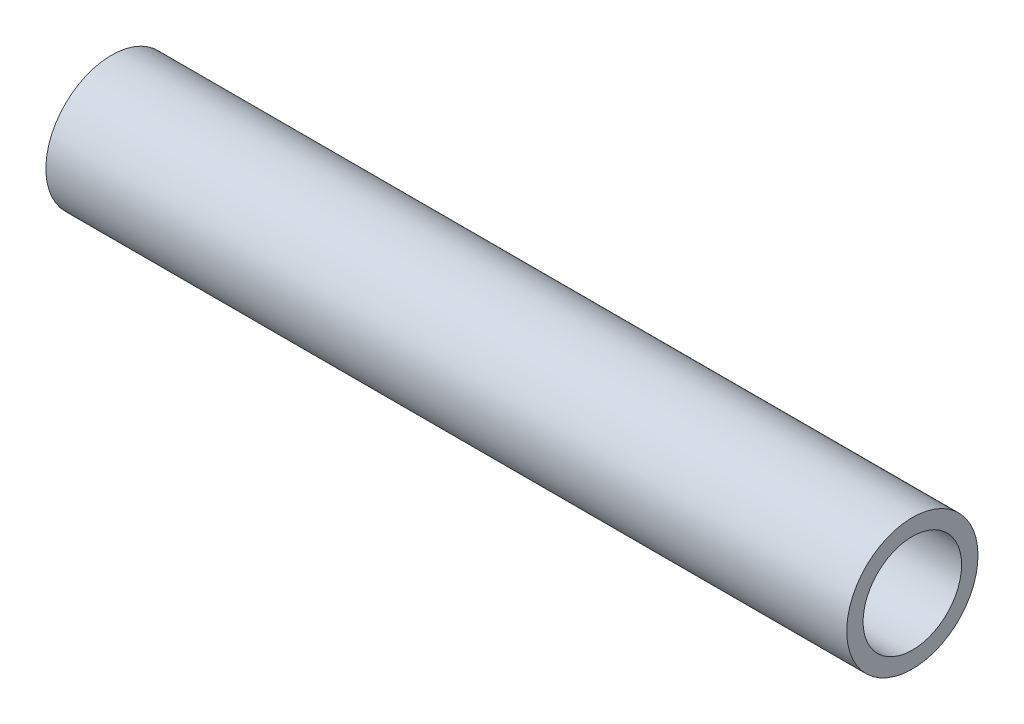
ISO-10303-21;
HEADER;
FILE_DESCRIPTION(('STEP AP214'),'2;1');
FILE_NAME('part.step','',(''),(''),'','','');
FILE_SCHEMA(('AUTOMOTIVE_DESIGN { 1 0 10303 214 1 1 1 1 }'));
ENDSEC;
DATA;
#1=APPLICATION_CONTEXT('core data for automotive mechanical design processes');
#2=APPLICATION_PROTOCOL_DEFINITION('international standard','automotive_design',2000,#1);
#3=PRODUCT_CONTEXT('',#1,'mechanical');
#4=PRODUCT('Part','Part','',(#3));
#5=PRODUCT_RELATED_PRODUCT_CATEGORY('part','',(#4));
#6=PRODUCT_DEFINITION_FORMATION('','',#4);
#7=PRODUCT_DEFINITION_CONTEXT('part definition',#1,'design');
#8=PRODUCT_DEFINITION('design','',#6,#7);
#9=PRODUCT_DEFINITION_SHAPE('','',#8);
#10=(LENGTH_UNIT() NAMED_UNIT(*) SI_UNIT(.MILLI.,.METRE.));
#11=(NAMED_UNIT(*) PLANE_ANGLE_UNIT() SI_UNIT($,.RADIAN.));
#12=(NAMED_UNIT(*) SI_UNIT($,.STERADIAN.) SOLID_ANGLE_UNIT());
#13=UNCERTAINTY_MEASURE_WITH_UNIT(LENGTH_MEASURE(1.E-05),#10,'distance_accuracy_value','');
#14=(GEOMETRIC_REPRESENTATION_CONTEXT(3) GLOBAL_UNCERTAINTY_ASSIGNED_CONTEXT((#13)) GLOBAL_UNIT_ASSIGNED_CONTEXT((#10,
#11,#12)) REPRESENTATION_CONTEXT('',''));
#15=CARTESIAN_POINT('',(0.,0.,0.));
#16=DIRECTION('',(0.,0.,1.));
#17=DIRECTION('',(1.,0.,0.));
#18=AXIS2_PLACEMENT_3D('',#15,#16,#17);
#19=CARTESIAN_POINT('',(77.47,0.,0.));
#20=DIRECTION('',(1.,0.,0.));
#21=DIRECTION('',(0.,0.,-1.));
#22=AXIS2_PLACEMENT_3D('',#19,#20,#21);
#23=PLANE('',#22);
#24=CARTESIAN_POINT('',(77.47,0.,0.));
#25=DIRECTION('',(1.,0.,0.));
#26=DIRECTION('',(0.,0.,-1.));
#27=AXIS2_PLACEMENT_3D('',#24,#25,#26);
#28=CIRCLE('',#27,6.35);
#29=CARTESIAN_POINT('',(77.47,0.,-6.35));
#30=VERTEX_POINT('',#29);
#31=EDGE_CURVE('E10',#30,#30,#28,.T.);
#32=ORIENTED_EDGE('',*,*,#31,.T.);
#33=EDGE_LOOP('',(#32));
#34=FACE_BOUND('',#33,.T.);
#35=CARTESIAN_POINT('',(77.47,0.,0.));
#36=DIRECTION('',(1.,0.,0.));
#37=DIRECTION('',(0.,0.,-1.));
#38=AXIS2_PLACEMENT_3D('',#35,#36,#37);
#39=CIRCLE('',#38,4.7625);
#40=CARTESIAN_POINT('',(77.47,0.,-4.7625));
#41=VERTEX_POINT('',#40);
#42=EDGE_CURVE('E42',#41,#41,#39,.T.);
#43=ORIENTED_EDGE('',*,*,#42,.F.);
#44=EDGE_LOOP('',(#43));
#45=FACE_BOUND('',#44,.T.);
#46=ADVANCED_FACE('F31',(#34,#45),#23,.T.);
#47=CARTESIAN_POINT('',(0.,0.,0.));
#48=DIRECTION('',(1.,0.,0.));
#49=DIRECTION('',(0.,0.,-1.));
#50=AXIS2_PLACEMENT_3D('',#47,#48,#49);
#51=PLANE('',#50);
#52=CARTESIAN_POINT('',(0.,0.,0.));
#53=DIRECTION('',(1.,0.,0.));
#54=DIRECTION('',(0.,0.,-1.));
#55=AXIS2_PLACEMENT_3D('',#52,#53,#54);
#56=CIRCLE('',#55,6.35);
#57=CARTESIAN_POINT('',(0.,0.,-6.35));
#58=VERTEX_POINT('',#57);
#59=EDGE_CURVE('E35',#58,#58,#56,.T.);
#60=ORIENTED_EDGE('',*,*,#59,.F.);
#61=EDGE_LOOP('',(#60));
#62=FACE_BOUND('',#61,.T.);
#63=CARTESIAN_POINT('',(0.,0.,0.));
#64=DIRECTION('',(1.,0.,0.));
#65=DIRECTION('',(0.,0.,-1.));
#66=AXIS2_PLACEMENT_3D('',#63,#64,#65);
#67=CIRCLE('',#66,4.7625);
#68=CARTESIAN_POINT('',(0.,0.,-4.7625));
#69=VERTEX_POINT('',#68);
#70=EDGE_CURVE('E44',#69,#69,#67,.T.);
#71=ORIENTED_EDGE('',*,*,#70,.T.);
#72=EDGE_LOOP('',(#71));
#73=FACE_BOUND('',#72,.T.);
#74=ADVANCED_FACE('F54',(#62,#73),#51,.F.);
#75=CARTESIAN_POINT('',(77.47,0.,0.));
#76=DIRECTION('',(-1.,0.,0.));
#77=DIRECTION('',(0.,0.,1.));
#78=AXIS2_PLACEMENT_3D('',#75,#76,#77);
#79=CYLINDRICAL_SURFACE('',#78,6.35);
#80=ORIENTED_EDGE('',*,*,#31,.F.);
#81=EDGE_LOOP('',(#80));
#82=FACE_BOUND('',#81,.T.);
#83=ORIENTED_EDGE('',*,*,#59,.T.);
#84=EDGE_LOOP('',(#83));
#85=FACE_BOUND('',#84,.T.);
#86=ADVANCED_FACE('F33',(#82,#85),#79,.T.);
#87=CARTESIAN_POINT('',(77.47,0.,0.));
#88=DIRECTION('',(-1.,0.,0.));
#89=DIRECTION('',(0.,0.,1.));
#90=AXIS2_PLACEMENT_3D('',#87,#88,#89);
#91=CYLINDRICAL_SURFACE('',#90,4.7625);
#92=ORIENTED_EDGE('',*,*,#42,.T.);
#93=EDGE_LOOP('',(#92));
#94=FACE_BOUND('',#93,.T.);
#95=ORIENTED_EDGE('',*,*,#70,.F.);
#96=EDGE_LOOP('',(#95));
#97=FACE_BOUND('',#96,.T.);
#98=ADVANCED_FACE('F50',(#94,#97),#91,.F.);
#99=CLOSED_SHELL('',(#46,#74,#86,#98));
#100=MANIFOLD_SOLID_BREP('B2',#99);
#101=ADVANCED_BREP_SHAPE_REPRESENTATION('',(#18,#100),#14);
#102=SHAPE_DEFINITION_REPRESENTATION(#9,#101);
ENDSEC;
END-ISO-10303-21;
